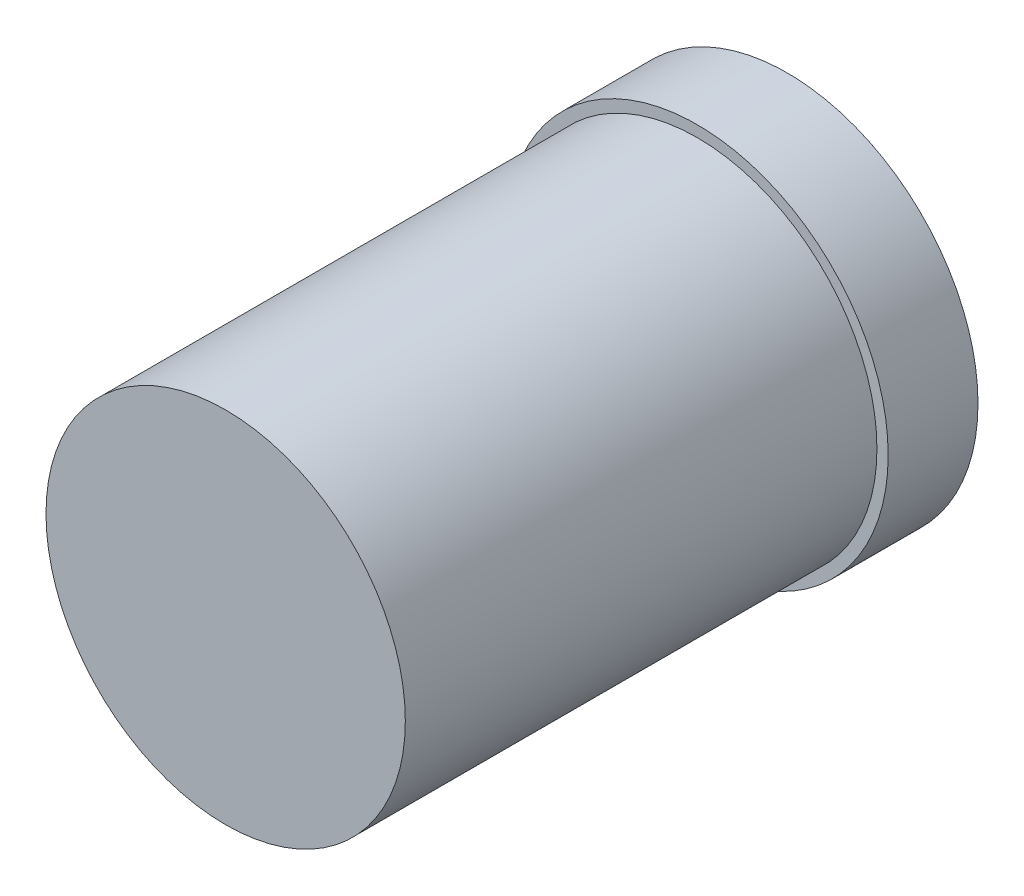
ISO-10303-21;
HEADER;
FILE_DESCRIPTION(('STEP AP214'),'2;1');
FILE_NAME('part.step','',(''),(''),'','','');
FILE_SCHEMA(('AUTOMOTIVE_DESIGN { 1 0 10303 214 1 1 1 1 }'));
ENDSEC;
DATA;
#1=APPLICATION_CONTEXT('core data for automotive mechanical design processes');
#2=APPLICATION_PROTOCOL_DEFINITION('international standard','automotive_design',2000,#1);
#3=PRODUCT_CONTEXT('',#1,'mechanical');
#4=PRODUCT('Part','Part','',(#3));
#5=PRODUCT_RELATED_PRODUCT_CATEGORY('part','',(#4));
#6=PRODUCT_DEFINITION_FORMATION('','',#4);
#7=PRODUCT_DEFINITION_CONTEXT('part definition',#1,'design');
#8=PRODUCT_DEFINITION('design','',#6,#7);
#9=PRODUCT_DEFINITION_SHAPE('','',#8);
#10=(LENGTH_UNIT() NAMED_UNIT(*) SI_UNIT(.MILLI.,.METRE.));
#11=(NAMED_UNIT(*) PLANE_ANGLE_UNIT() SI_UNIT($,.RADIAN.));
#12=(NAMED_UNIT(*) SI_UNIT($,.STERADIAN.) SOLID_ANGLE_UNIT());
#13=UNCERTAINTY_MEASURE_WITH_UNIT(LENGTH_MEASURE(1.E-05),#10,'distance_accuracy_value','');
#14=(GEOMETRIC_REPRESENTATION_CONTEXT(3) GLOBAL_UNCERTAINTY_ASSIGNED_CONTEXT((#13)) GLOBAL_UNIT_ASSIGNED_CONTEXT((#10,
#11,#12)) REPRESENTATION_CONTEXT('',''));
#15=CARTESIAN_POINT('',(0.,0.,0.));
#16=DIRECTION('',(0.,0.,1.));
#17=DIRECTION('',(1.,0.,0.));
#18=AXIS2_PLACEMENT_3D('',#15,#16,#17);
#19=CARTESIAN_POINT('',(0.,0.,40.));
#20=DIRECTION('',(0.,0.,-1.));
#21=DIRECTION('',(-1.,0.,0.));
#22=AXIS2_PLACEMENT_3D('',#19,#20,#21);
#23=CYLINDRICAL_SURFACE('',#22,85.);
#24=CARTESIAN_POINT('',(0.,0.,40.));
#25=DIRECTION('',(0.,0.,1.));
#26=DIRECTION('',(1.,0.,0.));
#27=AXIS2_PLACEMENT_3D('',#24,#25,#26);
#28=CIRCLE('',#27,85.);
#29=CARTESIAN_POINT('',(85.,0.,40.));
#30=VERTEX_POINT('',#29);
#31=EDGE_CURVE('E38',#30,#30,#28,.T.);
#32=ORIENTED_EDGE('',*,*,#31,.F.);
#33=EDGE_LOOP('',(#32));
#34=FACE_BOUND('',#33,.T.);
#35=CARTESIAN_POINT('',(0.,0.,0.));
#36=DIRECTION('',(0.,0.,1.));
#37=DIRECTION('',(1.,0.,0.));
#38=AXIS2_PLACEMENT_3D('',#35,#36,#37);
#39=CIRCLE('',#38,85.);
#40=CARTESIAN_POINT('',(85.,0.,0.));
#41=VERTEX_POINT('',#40);
#42=EDGE_CURVE('E34',#41,#41,#39,.T.);
#43=ORIENTED_EDGE('',*,*,#42,.T.);
#44=EDGE_LOOP('',(#43));
#45=FACE_BOUND('',#44,.T.);
#46=ADVANCED_FACE('F31',(#34,#45),#23,.T.);
#47=CARTESIAN_POINT('',(0.,0.,40.));
#48=DIRECTION('',(0.,0.,1.));
#49=DIRECTION('',(1.,0.,0.));
#50=AXIS2_PLACEMENT_3D('',#47,#48,#49);
#51=PLANE('',#50);
#52=CARTESIAN_POINT('',(0.,0.,40.));
#53=DIRECTION('',(0.,0.,1.));
#54=DIRECTION('',(1.,0.,0.));
#55=AXIS2_PLACEMENT_3D('',#52,#53,#54);
#56=CIRCLE('',#55,80.);
#57=CARTESIAN_POINT('',(80.,0.,40.));
#58=VERTEX_POINT('',#57);
#59=EDGE_CURVE('E10',#58,#58,#56,.T.);
#60=ORIENTED_EDGE('',*,*,#59,.F.);
#61=EDGE_LOOP('',(#60));
#62=FACE_BOUND('',#61,.T.);
#63=ORIENTED_EDGE('',*,*,#31,.T.);
#64=EDGE_LOOP('',(#63));
#65=FACE_BOUND('',#64,.T.);
#66=ADVANCED_FACE('F55',(#62,#65),#51,.T.);
#67=CARTESIAN_POINT('',(0.,0.,0.));
#68=DIRECTION('',(0.,0.,1.));
#69=DIRECTION('',(1.,0.,0.));
#70=AXIS2_PLACEMENT_3D('',#67,#68,#69);
#71=PLANE('',#70);
#72=ORIENTED_EDGE('',*,*,#42,.F.);
#73=EDGE_LOOP('',(#72));
#74=FACE_BOUND('',#73,.T.);
#75=ADVANCED_FACE('F52',(#74),#71,.F.);
#76=CARTESIAN_POINT('',(0.,0.,80.));
#77=DIRECTION('',(0.,0.,-1.));
#78=DIRECTION('',(-1.,0.,0.));
#79=AXIS2_PLACEMENT_3D('',#76,#77,#78);
#80=CYLINDRICAL_SURFACE('',#79,80.);
#81=ORIENTED_EDGE('',*,*,#59,.T.);
#82=EDGE_LOOP('',(#81));
#83=FACE_BOUND('',#82,.T.);
#84=CARTESIAN_POINT('',(0.,0.,250.));
#85=DIRECTION('',(0.,0.,1.));
#86=DIRECTION('',(1.,0.,0.));
#87=AXIS2_PLACEMENT_3D('',#84,#85,#86);
#88=CIRCLE('',#87,80.);
#89=CARTESIAN_POINT('',(80.,0.,250.));
#90=VERTEX_POINT('',#89);
#91=EDGE_CURVE('E44',#90,#90,#88,.T.);
#92=ORIENTED_EDGE('',*,*,#91,.F.);
#93=EDGE_LOOP('',(#92));
#94=FACE_BOUND('',#93,.T.);
#95=ADVANCED_FACE('F54',(#83,#94),#80,.T.);
#96=CARTESIAN_POINT('',(0.,0.,250.));
#97=DIRECTION('',(0.,0.,1.));
#98=DIRECTION('',(1.,0.,0.));
#99=AXIS2_PLACEMENT_3D('',#96,#97,#98);
#100=PLANE('',#99);
#101=ORIENTED_EDGE('',*,*,#91,.T.);
#102=EDGE_LOOP('',(#101));
#103=FACE_BOUND('',#102,.T.);
#104=ADVANCED_FACE('F60',(#103),#100,.T.);
#105=CLOSED_SHELL('',(#46,#66,#75,#95,#104));
#106=MANIFOLD_SOLID_BREP('B2',#105);
#107=ADVANCED_BREP_SHAPE_REPRESENTATION('',(#18,#106),#14);
#108=SHAPE_DEFINITION_REPRESENTATION(#9,#107);
ENDSEC;
END-ISO-10303-21;
